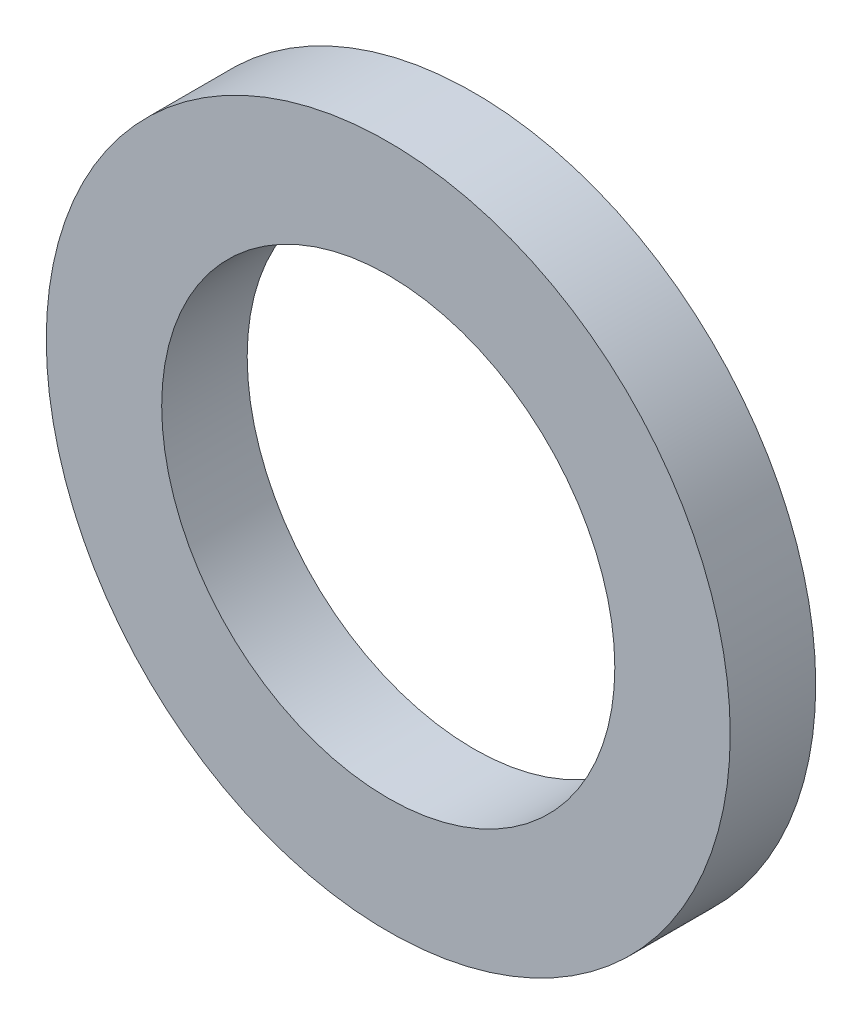
ISO-10303-21;
HEADER;
FILE_DESCRIPTION(('STEP AP214'),'2;1');
FILE_NAME('part.step','',(''),(''),'','','');
FILE_SCHEMA(('AUTOMOTIVE_DESIGN { 1 0 10303 214 1 1 1 1 }'));
ENDSEC;
DATA;
#1=APPLICATION_CONTEXT('core data for automotive mechanical design processes');
#2=APPLICATION_PROTOCOL_DEFINITION('international standard','automotive_design',2000,#1);
#3=PRODUCT_CONTEXT('',#1,'mechanical');
#4=PRODUCT('Part','Part','',(#3));
#5=PRODUCT_RELATED_PRODUCT_CATEGORY('part','',(#4));
#6=PRODUCT_DEFINITION_FORMATION('','',#4);
#7=PRODUCT_DEFINITION_CONTEXT('part definition',#1,'design');
#8=PRODUCT_DEFINITION('design','',#6,#7);
#9=PRODUCT_DEFINITION_SHAPE('','',#8);
#10=(LENGTH_UNIT() NAMED_UNIT(*) SI_UNIT(.MILLI.,.METRE.));
#11=(NAMED_UNIT(*) PLANE_ANGLE_UNIT() SI_UNIT($,.RADIAN.));
#12=(NAMED_UNIT(*) SI_UNIT($,.STERADIAN.) SOLID_ANGLE_UNIT());
#13=UNCERTAINTY_MEASURE_WITH_UNIT(LENGTH_MEASURE(1.E-05),#10,'distance_accuracy_value','');
#14=(GEOMETRIC_REPRESENTATION_CONTEXT(3) GLOBAL_UNCERTAINTY_ASSIGNED_CONTEXT((#13)) GLOBAL_UNIT_ASSIGNED_CONTEXT((#10,
#11,#12)) REPRESENTATION_CONTEXT('',''));
#15=CARTESIAN_POINT('',(0.,0.,0.));
#16=DIRECTION('',(0.,0.,1.));
#17=DIRECTION('',(1.,0.,0.));
#18=AXIS2_PLACEMENT_3D('',#15,#16,#17);
#19=CARTESIAN_POINT('',(0.,0.,1.));
#20=DIRECTION('',(0.,0.,1.));
#21=DIRECTION('',(1.,0.,0.));
#22=AXIS2_PLACEMENT_3D('',#19,#20,#21);
#23=PLANE('',#22);
#24=CARTESIAN_POINT('',(0.,0.,1.));
#25=DIRECTION('',(0.,0.,1.));
#26=DIRECTION('',(1.,0.,0.));
#27=AXIS2_PLACEMENT_3D('',#24,#25,#26);
#28=CIRCLE('',#27,4.);
#29=CARTESIAN_POINT('',(4.,0.,1.));
#30=VERTEX_POINT('',#29);
#31=EDGE_CURVE('E11',#30,#30,#28,.T.);
#32=ORIENTED_EDGE('',*,*,#31,.T.);
#33=EDGE_LOOP('',(#32));
#34=FACE_BOUND('',#33,.T.);
#35=CARTESIAN_POINT('',(0.,0.,1.));
#36=DIRECTION('',(0.,0.,1.));
#37=DIRECTION('',(1.,0.,0.));
#38=AXIS2_PLACEMENT_3D('',#35,#36,#37);
#39=CIRCLE('',#38,2.65);
#40=CARTESIAN_POINT('',(2.65,0.,1.));
#41=VERTEX_POINT('',#40);
#42=EDGE_CURVE('E59',#41,#41,#39,.T.);
#43=ORIENTED_EDGE('',*,*,#42,.F.);
#44=EDGE_LOOP('',(#43));
#45=FACE_BOUND('',#44,.T.);
#46=ADVANCED_FACE('F44',(#34,#45),#23,.T.);
#47=CARTESIAN_POINT('',(0.,0.,0.));
#48=DIRECTION('',(0.,0.,1.));
#49=DIRECTION('',(1.,0.,0.));
#50=AXIS2_PLACEMENT_3D('',#47,#48,#49);
#51=PLANE('',#50);
#52=CARTESIAN_POINT('',(0.,0.,0.));
#53=DIRECTION('',(0.,0.,1.));
#54=DIRECTION('',(1.,0.,0.));
#55=AXIS2_PLACEMENT_3D('',#52,#53,#54);
#56=CIRCLE('',#55,4.);
#57=CARTESIAN_POINT('',(4.,0.,0.));
#58=VERTEX_POINT('',#57);
#59=EDGE_CURVE('E48',#58,#58,#56,.T.);
#60=ORIENTED_EDGE('',*,*,#59,.F.);
#61=EDGE_LOOP('',(#60));
#62=FACE_BOUND('',#61,.T.);
#63=CARTESIAN_POINT('',(0.,0.,0.));
#64=DIRECTION('',(0.,0.,1.));
#65=DIRECTION('',(1.,0.,0.));
#66=AXIS2_PLACEMENT_3D('',#63,#64,#65);
#67=CIRCLE('',#66,2.65);
#68=CARTESIAN_POINT('',(2.65,0.,0.));
#69=VERTEX_POINT('',#68);
#70=EDGE_CURVE('E61',#69,#69,#67,.T.);
#71=ORIENTED_EDGE('',*,*,#70,.T.);
#72=EDGE_LOOP('',(#71));
#73=FACE_BOUND('',#72,.T.);
#74=ADVANCED_FACE('F73',(#62,#73),#51,.F.);
#75=CARTESIAN_POINT('',(0.,0.,1.));
#76=DIRECTION('',(0.,0.,-1.));
#77=DIRECTION('',(-1.,0.,0.));
#78=AXIS2_PLACEMENT_3D('',#75,#76,#77);
#79=CYLINDRICAL_SURFACE('',#78,4.);
#80=ORIENTED_EDGE('',*,*,#31,.F.);
#81=EDGE_LOOP('',(#80));
#82=FACE_BOUND('',#81,.T.);
#83=ORIENTED_EDGE('',*,*,#59,.T.);
#84=EDGE_LOOP('',(#83));
#85=FACE_BOUND('',#84,.T.);
#86=ADVANCED_FACE('F46',(#82,#85),#79,.T.);
#87=CARTESIAN_POINT('',(0.,0.,1.));
#88=DIRECTION('',(0.,0.,-1.));
#89=DIRECTION('',(-1.,0.,0.));
#90=AXIS2_PLACEMENT_3D('',#87,#88,#89);
#91=CYLINDRICAL_SURFACE('',#90,2.65);
#92=ORIENTED_EDGE('',*,*,#42,.T.);
#93=EDGE_LOOP('',(#92));
#94=FACE_BOUND('',#93,.T.);
#95=ORIENTED_EDGE('',*,*,#70,.F.);
#96=EDGE_LOOP('',(#95));
#97=FACE_BOUND('',#96,.T.);
#98=ADVANCED_FACE('F69',(#94,#97),#91,.F.);
#99=CLOSED_SHELL('',(#46,#74,#86,#98));
#100=MANIFOLD_SOLID_BREP('B2',#99);
#101=ADVANCED_BREP_SHAPE_REPRESENTATION('',(#18,#100),#14);
#102=SHAPE_DEFINITION_REPRESENTATION(#9,#101);
ENDSEC;
END-ISO-10303-21;
